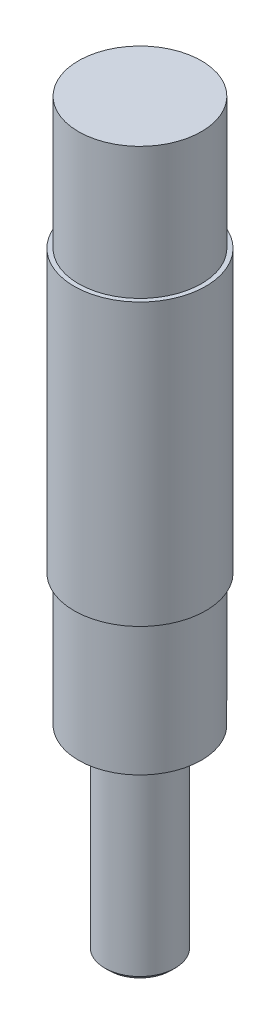
ISO-10303-21;
HEADER;
FILE_DESCRIPTION(('STEP AP214'),'2;1');
FILE_NAME('part.step','',(''),(''),'','','');
FILE_SCHEMA(('AUTOMOTIVE_DESIGN { 1 0 10303 214 1 1 1 1 }'));
ENDSEC;
DATA;
#1=APPLICATION_CONTEXT('core data for automotive mechanical design processes');
#2=APPLICATION_PROTOCOL_DEFINITION('international standard','automotive_design',2000,#1);
#3=PRODUCT_CONTEXT('',#1,'mechanical');
#4=PRODUCT('Part','Part','',(#3));
#5=PRODUCT_RELATED_PRODUCT_CATEGORY('part','',(#4));
#6=PRODUCT_DEFINITION_FORMATION('','',#4);
#7=PRODUCT_DEFINITION_CONTEXT('part definition',#1,'design');
#8=PRODUCT_DEFINITION('design','',#6,#7);
#9=PRODUCT_DEFINITION_SHAPE('','',#8);
#10=(LENGTH_UNIT() NAMED_UNIT(*) SI_UNIT(.MILLI.,.METRE.));
#11=(NAMED_UNIT(*) PLANE_ANGLE_UNIT() SI_UNIT($,.RADIAN.));
#12=(NAMED_UNIT(*) SI_UNIT($,.STERADIAN.) SOLID_ANGLE_UNIT());
#13=UNCERTAINTY_MEASURE_WITH_UNIT(LENGTH_MEASURE(1.E-05),#10,'distance_accuracy_value','');
#14=(GEOMETRIC_REPRESENTATION_CONTEXT(3) GLOBAL_UNCERTAINTY_ASSIGNED_CONTEXT((#13)) GLOBAL_UNIT_ASSIGNED_CONTEXT((#10,
#11,#12)) REPRESENTATION_CONTEXT('',''));
#15=CARTESIAN_POINT('',(0.,0.,0.));
#16=DIRECTION('',(0.,0.,1.));
#17=DIRECTION('',(1.,0.,0.));
#18=AXIS2_PLACEMENT_3D('',#15,#16,#17);
#19=CARTESIAN_POINT('',(0.,-15.,0.));
#20=DIRECTION('',(0.,-1.,0.));
#21=DIRECTION('',(0.,0.,-1.));
#22=AXIS2_PLACEMENT_3D('',#19,#20,#21);
#23=PLANE('',#22);
#24=CARTESIAN_POINT('',(0.,-15.,0.));
#25=DIRECTION('',(0.,-1.,0.));
#26=DIRECTION('',(0.,0.,-1.));
#27=AXIS2_PLACEMENT_3D('',#24,#25,#26);
#28=CIRCLE('',#27,7.);
#29=CARTESIAN_POINT('',(0.,-15.,-7.));
#30=VERTEX_POINT('',#29);
#31=EDGE_CURVE('E61',#30,#30,#28,.T.);
#32=ORIENTED_EDGE('',*,*,#31,.T.);
#33=EDGE_LOOP('',(#32));
#34=FACE_BOUND('',#33,.T.);
#35=CARTESIAN_POINT('',(0.,-15.,0.));
#36=DIRECTION('',(0.,-1.,0.));
#37=DIRECTION('',(0.,0.,-1.));
#38=AXIS2_PLACEMENT_3D('',#35,#36,#37);
#39=CIRCLE('',#38,4.);
#40=CARTESIAN_POINT('',(0.,-15.,4.));
#41=VERTEX_POINT('',#40);
#42=EDGE_CURVE('E66',#41,#41,#39,.T.);
#43=ORIENTED_EDGE('',*,*,#42,.F.);
#44=EDGE_LOOP('',(#43));
#45=FACE_BOUND('',#44,.T.);
#46=ADVANCED_FACE('F34',(#34,#45),#23,.T.);
#47=CARTESIAN_POINT('',(0.,0.,0.));
#48=DIRECTION('',(0.,1.,0.));
#49=DIRECTION('',(0.,0.,1.));
#50=AXIS2_PLACEMENT_3D('',#47,#48,#49);
#51=PLANE('',#50);
#52=CARTESIAN_POINT('',(0.,0.,0.));
#53=DIRECTION('',(0.,1.,0.));
#54=DIRECTION('',(0.,0.,1.));
#55=AXIS2_PLACEMENT_3D('',#52,#53,#54);
#56=CIRCLE('',#55,7.5);
#57=CARTESIAN_POINT('',(0.,0.,7.5));
#58=VERTEX_POINT('',#57);
#59=EDGE_CURVE('E52',#58,#58,#56,.T.);
#60=ORIENTED_EDGE('',*,*,#59,.F.);
#61=EDGE_LOOP('',(#60));
#62=FACE_BOUND('',#61,.T.);
#63=CARTESIAN_POINT('',(0.,0.,0.));
#64=DIRECTION('',(0.,1.,0.));
#65=DIRECTION('',(0.,0.,1.));
#66=AXIS2_PLACEMENT_3D('',#63,#64,#65);
#67=CIRCLE('',#66,7.);
#68=CARTESIAN_POINT('',(0.,0.,7.));
#69=VERTEX_POINT('',#68);
#70=EDGE_CURVE('E45',#69,#69,#67,.F.);
#71=ORIENTED_EDGE('',*,*,#70,.F.);
#72=EDGE_LOOP('',(#71));
#73=FACE_BOUND('',#72,.T.);
#74=ADVANCED_FACE('F73',(#62,#73),#51,.F.);
#75=CARTESIAN_POINT('',(0.,32.,0.));
#76=DIRECTION('',(0.,1.,0.));
#77=DIRECTION('',(0.,0.,1.));
#78=AXIS2_PLACEMENT_3D('',#75,#76,#77);
#79=PLANE('',#78);
#80=CARTESIAN_POINT('',(0.,32.,0.));
#81=DIRECTION('',(0.,1.,0.));
#82=DIRECTION('',(0.,0.,1.));
#83=AXIS2_PLACEMENT_3D('',#80,#81,#82);
#84=CIRCLE('',#83,7.5);
#85=CARTESIAN_POINT('',(0.,32.,7.5));
#86=VERTEX_POINT('',#85);
#87=EDGE_CURVE('E49',#86,#86,#84,.T.);
#88=ORIENTED_EDGE('',*,*,#87,.T.);
#89=EDGE_LOOP('',(#88));
#90=FACE_BOUND('',#89,.T.);
#91=CARTESIAN_POINT('',(0.,32.,0.));
#92=DIRECTION('',(0.,1.,0.));
#93=DIRECTION('',(0.,0.,1.));
#94=AXIS2_PLACEMENT_3D('',#91,#92,#93);
#95=CIRCLE('',#94,7.);
#96=CARTESIAN_POINT('',(0.,32.,7.));
#97=VERTEX_POINT('',#96);
#98=EDGE_CURVE('E58',#97,#97,#95,.T.);
#99=ORIENTED_EDGE('',*,*,#98,.F.);
#100=EDGE_LOOP('',(#99));
#101=FACE_BOUND('',#100,.T.);
#102=ADVANCED_FACE('F79',(#90,#101),#79,.T.);
#103=CARTESIAN_POINT('',(0.,32.,0.));
#104=DIRECTION('',(0.,-1.,0.));
#105=DIRECTION('',(0.,0.,-1.));
#106=AXIS2_PLACEMENT_3D('',#103,#104,#105);
#107=CYLINDRICAL_SURFACE('',#106,7.5);
#108=ORIENTED_EDGE('',*,*,#87,.F.);
#109=EDGE_LOOP('',(#108));
#110=FACE_BOUND('',#109,.T.);
#111=ORIENTED_EDGE('',*,*,#59,.T.);
#112=EDGE_LOOP('',(#111));
#113=FACE_BOUND('',#112,.T.);
#114=ADVANCED_FACE('F96',(#110,#113),#107,.T.);
#115=CARTESIAN_POINT('',(0.,47.,0.));
#116=DIRECTION('',(0.,-1.,0.));
#117=DIRECTION('',(0.,0.,-1.));
#118=AXIS2_PLACEMENT_3D('',#115,#116,#117);
#119=CYLINDRICAL_SURFACE('',#118,7.);
#120=CARTESIAN_POINT('',(0.,47.,0.));
#121=DIRECTION('',(0.,1.,0.));
#122=DIRECTION('',(0.,0.,1.));
#123=AXIS2_PLACEMENT_3D('',#120,#121,#122);
#124=CIRCLE('',#123,7.);
#125=CARTESIAN_POINT('',(0.,47.,7.));
#126=VERTEX_POINT('',#125);
#127=EDGE_CURVE('E55',#126,#126,#124,.T.);
#128=ORIENTED_EDGE('',*,*,#127,.F.);
#129=EDGE_LOOP('',(#128));
#130=FACE_BOUND('',#129,.T.);
#131=ORIENTED_EDGE('',*,*,#98,.T.);
#132=EDGE_LOOP('',(#131));
#133=FACE_BOUND('',#132,.T.);
#134=ADVANCED_FACE('F92',(#130,#133),#119,.T.);
#135=CARTESIAN_POINT('',(0.,47.,0.));
#136=DIRECTION('',(0.,1.,0.));
#137=DIRECTION('',(0.,0.,1.));
#138=AXIS2_PLACEMENT_3D('',#135,#136,#137);
#139=PLANE('',#138);
#140=ORIENTED_EDGE('',*,*,#127,.T.);
#141=EDGE_LOOP('',(#140));
#142=FACE_BOUND('',#141,.T.);
#143=ADVANCED_FACE('F88',(#142),#139,.T.);
#144=CARTESIAN_POINT('',(0.,-15.,0.));
#145=DIRECTION('',(0.,1.,0.));
#146=DIRECTION('',(0.,0.,1.));
#147=AXIS2_PLACEMENT_3D('',#144,#145,#146);
#148=CYLINDRICAL_SURFACE('',#147,7.);
#149=ORIENTED_EDGE('',*,*,#31,.F.);
#150=EDGE_LOOP('',(#149));
#151=FACE_BOUND('',#150,.T.);
#152=ORIENTED_EDGE('',*,*,#70,.T.);
#153=EDGE_LOOP('',(#152));
#154=FACE_BOUND('',#153,.T.);
#155=ADVANCED_FACE('F85',(#151,#154),#148,.T.);
#156=CARTESIAN_POINT('',(0.,-37.5,0.));
#157=DIRECTION('',(0.,1.,0.));
#158=DIRECTION('',(0.,0.,1.));
#159=AXIS2_PLACEMENT_3D('',#156,#157,#158);
#160=CYLINDRICAL_SURFACE('',#159,4.);
#161=CARTESIAN_POINT('',(0.,-37.,0.));
#162=DIRECTION('',(0.,-1.,0.));
#163=DIRECTION('',(0.,0.,-1.));
#164=AXIS2_PLACEMENT_3D('',#161,#162,#163);
#165=CIRCLE('',#164,4.);
#166=CARTESIAN_POINT('',(0.,-37.,4.));
#167=VERTEX_POINT('',#166);
#168=EDGE_CURVE('E10',#167,#167,#165,.F.);
#169=CARTESIAN_POINT('',(0.,-37.,4.));
#170=CARTESIAN_POINT('',(0.,-36.7708333333334,4.));
#171=CARTESIAN_POINT('',(0.,-36.5416666666667,4.));
#172=CARTESIAN_POINT('',(0.,-36.0833333333334,4.));
#173=CARTESIAN_POINT('',(0.,-35.8541666666667,4.));
#174=CARTESIAN_POINT('',(0.,-35.3958333333334,4.));
#175=CARTESIAN_POINT('',(0.,-35.1666666666667,4.));
#176=CARTESIAN_POINT('',(0.,-34.7083333333334,4.));
#177=CARTESIAN_POINT('',(0.,-34.4791666666667,4.));
#178=CARTESIAN_POINT('',(0.,-34.0208333333334,4.));
#179=CARTESIAN_POINT('',(0.,-33.7916666666667,4.));
#180=CARTESIAN_POINT('',(0.,-33.3333333333334,4.));
#181=CARTESIAN_POINT('',(0.,-33.1041666666667,4.));
#182=CARTESIAN_POINT('',(0.,-32.6458333333333,4.));
#183=CARTESIAN_POINT('',(0.,-32.4166666666667,4.));
#184=CARTESIAN_POINT('',(0.,-31.9583333333334,4.));
#185=CARTESIAN_POINT('',(0.,-31.7291666666667,4.));
#186=CARTESIAN_POINT('',(0.,-31.2708333333334,4.));
#187=CARTESIAN_POINT('',(0.,-31.0416666666667,4.));
#188=CARTESIAN_POINT('',(0.,-30.5833333333334,4.));
#189=CARTESIAN_POINT('',(0.,-30.3541666666667,4.));
#190=CARTESIAN_POINT('',(0.,-29.8958333333334,4.));
#191=CARTESIAN_POINT('',(0.,-29.6666666666667,4.));
#192=CARTESIAN_POINT('',(0.,-29.2083333333334,4.));
#193=CARTESIAN_POINT('',(0.,-28.9791666666667,4.));
#194=CARTESIAN_POINT('',(0.,-28.5208333333334,4.));
#195=CARTESIAN_POINT('',(0.,-28.2916666666667,4.));
#196=CARTESIAN_POINT('',(0.,-27.8333333333334,4.));
#197=CARTESIAN_POINT('',(0.,-27.6041666666667,4.));
#198=CARTESIAN_POINT('',(0.,-27.1458333333333,4.));
#199=CARTESIAN_POINT('',(0.,-26.9166666666667,4.));
#200=CARTESIAN_POINT('',(0.,-26.4583333333333,4.));
#201=CARTESIAN_POINT('',(0.,-26.2291666666667,4.));
#202=CARTESIAN_POINT('',(0.,-25.7708333333333,4.));
#203=CARTESIAN_POINT('',(0.,-25.5416666666667,4.));
#204=CARTESIAN_POINT('',(0.,-25.0833333333333,4.));
#205=CARTESIAN_POINT('',(0.,-24.8541666666667,4.));
#206=CARTESIAN_POINT('',(0.,-24.3958333333333,4.));
#207=CARTESIAN_POINT('',(0.,-24.1666666666667,4.));
#208=CARTESIAN_POINT('',(0.,-23.7083333333333,4.));
#209=CARTESIAN_POINT('',(0.,-23.4791666666667,4.));
#210=CARTESIAN_POINT('',(0.,-23.0208333333333,4.));
#211=CARTESIAN_POINT('',(0.,-22.7916666666667,4.));
#212=CARTESIAN_POINT('',(0.,-22.3333333333333,4.));
#213=CARTESIAN_POINT('',(0.,-22.1041666666667,4.));
#214=CARTESIAN_POINT('',(0.,-21.6458333333333,4.));
#215=CARTESIAN_POINT('',(0.,-21.4166666666667,4.));
#216=CARTESIAN_POINT('',(0.,-20.9583333333333,4.));
#217=CARTESIAN_POINT('',(0.,-20.7291666666667,4.));
#218=CARTESIAN_POINT('',(0.,-20.2708333333333,4.));
#219=CARTESIAN_POINT('',(0.,-20.0416666666667,4.));
#220=CARTESIAN_POINT('',(0.,-19.5833333333333,4.));
#221=CARTESIAN_POINT('',(0.,-19.3541666666667,4.));
#222=CARTESIAN_POINT('',(0.,-18.8958333333333,4.));
#223=CARTESIAN_POINT('',(0.,-18.6666666666667,4.));
#224=CARTESIAN_POINT('',(0.,-18.2083333333333,4.));
#225=CARTESIAN_POINT('',(0.,-17.9791666666667,4.));
#226=CARTESIAN_POINT('',(0.,-17.5208333333333,4.));
#227=CARTESIAN_POINT('',(0.,-17.2916666666667,4.));
#228=CARTESIAN_POINT('',(0.,-16.8333333333333,4.));
#229=CARTESIAN_POINT('',(0.,-16.6041666666667,4.));
#230=CARTESIAN_POINT('',(0.,-16.1458333333333,4.));
#231=CARTESIAN_POINT('',(0.,-15.9166666666667,4.));
#232=CARTESIAN_POINT('',(0.,-15.4583333333333,4.));
#233=CARTESIAN_POINT('',(0.,-15.2291666666667,4.));
#234=CARTESIAN_POINT('',(0.,-15.,4.));
#235=B_SPLINE_CURVE_WITH_KNOTS('',3,(#169,#170,#171,#172,#173,#174,#175,#176,#177,#178,#179,
#180,#181,#182,#183,#184,#185,#186,#187,#188,#189,#190,#191,#192,#193,#194,#195,#196,#197,#198,
#199,#200,#201,#202,#203,#204,#205,#206,#207,#208,#209,#210,#211,#212,#213,#214,#215,#216,#217,
#218,#219,#220,#221,#222,#223,#224,#225,#226,#227,#228,#229,#230,#231,#232,#233,#234),
.UNSPECIFIED.,.F.,.F.,(4,2,2,2,2,2,2,2,2,2,2,2,2,2,2,2,2,2,2,2,2,2,2,2,2,2,2,2,2,2,2,2,4),(0.,
0.687500000000001,1.375,2.0625,2.75,3.4375,4.125,4.8125,5.50000000000001,6.18750000000001,
6.87500000000001,7.56250000000001,8.25000000000001,8.93750000000001,9.62500000000001,10.3125,
11.,11.6875,12.375,13.0625,13.75,14.4375,15.125,15.8125,16.5,17.1875,17.875,18.5625,19.25,
19.9375,20.625,21.3125,22.),.UNSPECIFIED.);
#236=EDGE_CURVE('BSEAM70',#167,#41,#235,.T.);
#237=ORIENTED_EDGE('',*,*,#168,.T.);
#238=ORIENTED_EDGE('',*,*,#42,.T.);
#239=ORIENTED_EDGE('',*,*,#236,.T.);
#240=ORIENTED_EDGE('',*,*,#236,.F.);
#241=EDGE_LOOP('',(#237,#239,#238,#240));
#242=FACE_BOUND('',#241,.T.);
#243=ADVANCED_FACE('F70',(#242),#160,.T.);
#244=CARTESIAN_POINT('',(0.,-37.5,0.));
#245=DIRECTION('',(0.,-1.,0.));
#246=DIRECTION('',(0.,0.,-1.));
#247=AXIS2_PLACEMENT_3D('',#244,#245,#246);
#248=PLANE('',#247);
#249=CARTESIAN_POINT('',(0.,-37.5,0.));
#250=DIRECTION('',(0.,-1.,0.));
#251=DIRECTION('',(0.,0.,-1.));
#252=AXIS2_PLACEMENT_3D('',#249,#250,#251);
#253=CIRCLE('',#252,3.50000000000002);
#254=CARTESIAN_POINT('',(0.,-37.5,-3.50000000000002));
#255=VERTEX_POINT('',#254);
#256=EDGE_CURVE('E41',#255,#255,#253,.T.);
#257=ORIENTED_EDGE('',*,*,#256,.T.);
#258=EDGE_LOOP('',(#257));
#259=FACE_BOUND('',#258,.T.);
#260=ADVANCED_FACE('F134',(#259),#248,.T.);
#261=CARTESIAN_POINT('',(0.,-37.5,0.));
#262=DIRECTION('',(0.,1.,0.));
#263=DIRECTION('',(0.,0.,1.));
#264=AXIS2_PLACEMENT_3D('',#261,#262,#263);
#265=CONICAL_SURFACE('',#264,3.50000000000002,0.785398163397459);
#266=ORIENTED_EDGE('',*,*,#168,.F.);
#267=EDGE_LOOP('',(#266));
#268=FACE_BOUND('',#267,.T.);
#269=ORIENTED_EDGE('',*,*,#256,.F.);
#270=EDGE_LOOP('',(#269));
#271=FACE_BOUND('',#270,.T.);
#272=ADVANCED_FACE('F36',(#268,#271),#265,.T.);
#273=CLOSED_SHELL('',(#46,#74,#102,#114,#134,#143,#155,#243,#260,#272));
#274=MANIFOLD_SOLID_BREP('B2',#273);
#275=ADVANCED_BREP_SHAPE_REPRESENTATION('',(#18,#274),#14);
#276=SHAPE_DEFINITION_REPRESENTATION(#9,#275);
ENDSEC;
END-ISO-10303-21;
